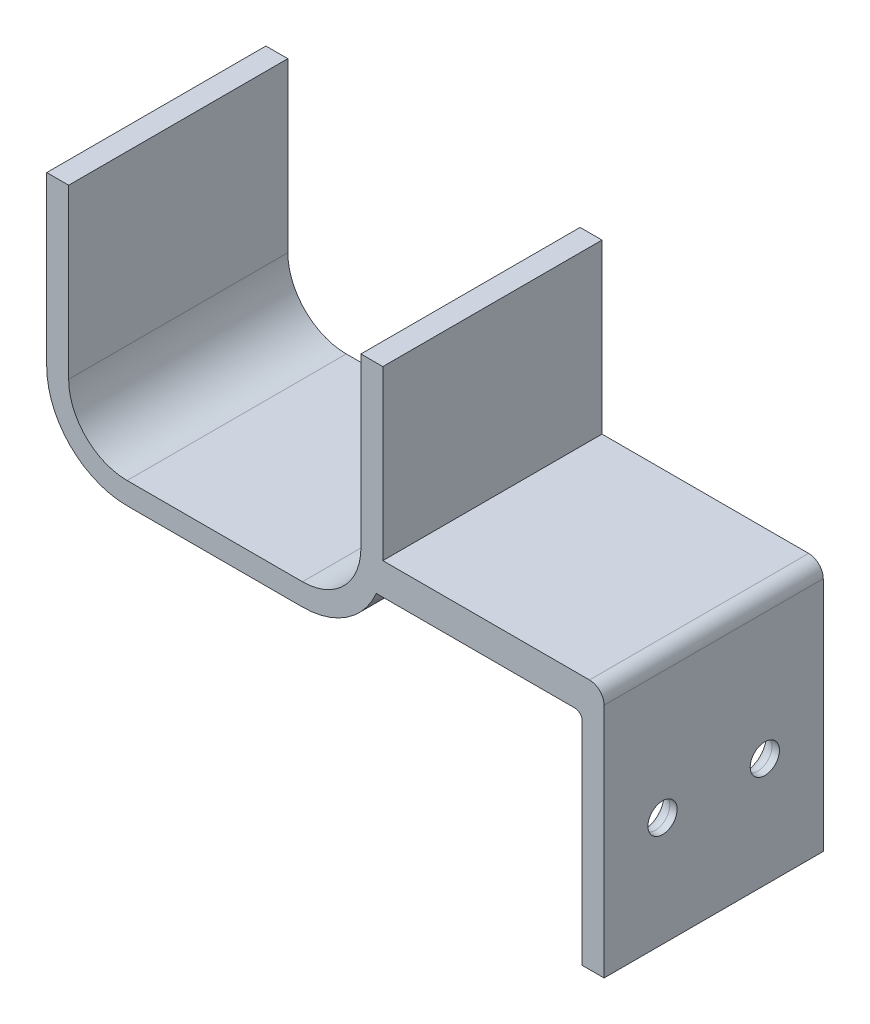
ISO-10303-21;
HEADER;
FILE_DESCRIPTION(('STEP AP214'),'2;1');
FILE_NAME('part.step','',(''),(''),'','','');
FILE_SCHEMA(('AUTOMOTIVE_DESIGN { 1 0 10303 214 1 1 1 1 }'));
ENDSEC;
DATA;
#1=APPLICATION_CONTEXT('core data for automotive mechanical design processes');
#2=APPLICATION_PROTOCOL_DEFINITION('international standard','automotive_design',2000,#1);
#3=PRODUCT_CONTEXT('',#1,'mechanical');
#4=PRODUCT('Part','Part','',(#3));
#5=PRODUCT_RELATED_PRODUCT_CATEGORY('part','',(#4));
#6=PRODUCT_DEFINITION_FORMATION('','',#4);
#7=PRODUCT_DEFINITION_CONTEXT('part definition',#1,'design');
#8=PRODUCT_DEFINITION('design','',#6,#7);
#9=PRODUCT_DEFINITION_SHAPE('','',#8);
#10=(LENGTH_UNIT() NAMED_UNIT(*) SI_UNIT(.MILLI.,.METRE.));
#11=(NAMED_UNIT(*) PLANE_ANGLE_UNIT() SI_UNIT($,.RADIAN.));
#12=(NAMED_UNIT(*) SI_UNIT($,.STERADIAN.) SOLID_ANGLE_UNIT());
#13=UNCERTAINTY_MEASURE_WITH_UNIT(LENGTH_MEASURE(1.E-05),#10,'distance_accuracy_value','');
#14=(GEOMETRIC_REPRESENTATION_CONTEXT(3) GLOBAL_UNCERTAINTY_ASSIGNED_CONTEXT((#13)) GLOBAL_UNIT_ASSIGNED_CONTEXT((#10,
#11,#12)) REPRESENTATION_CONTEXT('',''));
#15=CARTESIAN_POINT('',(0.,0.,0.));
#16=DIRECTION('',(0.,0.,1.));
#17=DIRECTION('',(1.,0.,0.));
#18=AXIS2_PLACEMENT_3D('',#15,#16,#17);
#19=CARTESIAN_POINT('',(53.282521300699,-27.3295887421391,30.));
#20=DIRECTION('',(0.,1.,0.));
#21=DIRECTION('',(-1.,0.,0.));
#22=AXIS2_PLACEMENT_3D('',#19,#20,#21);
#23=PLANE('',#22);
#24=DIRECTION('',(1.,0.,0.));
#25=VECTOR('',#24,1.);
#26=CARTESIAN_POINT('',(53.282521300699,-27.3295887421391,0.));
#27=LINE('',#26,#25);
#28=CARTESIAN_POINT('',(22.1121046930865,-27.3295887421391,0.));
#29=VERTEX_POINT('',#28);
#30=CARTESIAN_POINT('',(49.282521300699,-27.3295887421391,0.));
#31=VERTEX_POINT('',#30);
#32=EDGE_CURVE('E337',#29,#31,#27,.T.);
#33=ORIENTED_EDGE('',*,*,#32,.T.);
#34=DIRECTION('',(0.,0.,-1.));
#35=VECTOR('',#34,1.);
#36=CARTESIAN_POINT('',(49.282521300699,-27.3295887421391,30.));
#37=LINE('',#36,#35);
#38=CARTESIAN_POINT('',(49.282521300699,-27.3295887421391,30.));
#39=VERTEX_POINT('',#38);
#40=EDGE_CURVE('E211',#31,#39,#37,.F.);
#41=ORIENTED_EDGE('',*,*,#40,.T.);
#42=DIRECTION('',(1.,0.,0.));
#43=VECTOR('',#42,1.);
#44=CARTESIAN_POINT('',(53.282521300699,-27.3295887421391,30.));
#45=LINE('',#44,#43);
#46=CARTESIAN_POINT('',(22.1121046930865,-27.3295887421391,30.));
#47=VERTEX_POINT('',#46);
#48=EDGE_CURVE('E333',#47,#39,#45,.T.);
#49=ORIENTED_EDGE('',*,*,#48,.F.);
#50=DIRECTION('',(0.,0.,-1.));
#51=VECTOR('',#50,1.);
#52=CARTESIAN_POINT('',(22.1121046930865,-27.3295887421391,30.));
#53=LINE('',#52,#51);
#54=EDGE_CURVE('E328',#47,#29,#53,.T.);
#55=ORIENTED_EDGE('',*,*,#54,.T.);
#56=EDGE_LOOP('',(#33,#41,#49,#55));
#57=FACE_BOUND('',#56,.T.);
#58=ADVANCED_FACE('F32',(#57),#23,.F.);
#59=CARTESIAN_POINT('',(12.,-23.,30.));
#60=DIRECTION('',(0.,0.,-1.));
#61=DIRECTION('',(-1.,0.,0.));
#62=AXIS2_PLACEMENT_3D('',#59,#60,#61);
#63=CYLINDRICAL_SURFACE('',#62,11.);
#64=ORIENTED_EDGE('',*,*,#54,.F.);
#65=CARTESIAN_POINT('',(12.,-23.,30.));
#66=DIRECTION('',(0.,0.,1.));
#67=DIRECTION('',(1.,0.,0.));
#68=AXIS2_PLACEMENT_3D('',#65,#66,#67);
#69=CIRCLE('',#68,11.);
#70=CARTESIAN_POINT('',(11.9999999999999,-34.,30.));
#71=VERTEX_POINT('',#70);
#72=EDGE_CURVE('E379',#71,#47,#69,.T.);
#73=ORIENTED_EDGE('',*,*,#72,.F.);
#74=DIRECTION('',(0.,0.,-1.));
#75=VECTOR('',#74,1.);
#76=CARTESIAN_POINT('',(11.9999999999999,-34.,30.));
#77=LINE('',#76,#75);
#78=CARTESIAN_POINT('',(11.9999999999999,-34.,0.));
#79=VERTEX_POINT('',#78);
#80=EDGE_CURVE('E198',#71,#79,#77,.T.);
#81=ORIENTED_EDGE('',*,*,#80,.T.);
#82=CARTESIAN_POINT('',(12.,-23.,0.));
#83=DIRECTION('',(0.,0.,1.));
#84=DIRECTION('',(1.,0.,0.));
#85=AXIS2_PLACEMENT_3D('',#82,#83,#84);
#86=CIRCLE('',#85,11.);
#87=EDGE_CURVE('E188',#79,#29,#86,.T.);
#88=ORIENTED_EDGE('',*,*,#87,.T.);
#89=EDGE_LOOP('',(#64,#73,#81,#88));
#90=FACE_BOUND('',#89,.T.);
#91=ADVANCED_FACE('F253',(#90),#63,.T.);
#92=CARTESIAN_POINT('',(-12.,23.,30.));
#93=DIRECTION('',(0.,0.,1.));
#94=DIRECTION('',(1.,0.,0.));
#95=AXIS2_PLACEMENT_3D('',#92,#93,#94);
#96=PLANE('',#95);
#97=DIRECTION('',(-1.,0.,0.));
#98=VECTOR('',#97,1.);
#99=CARTESIAN_POINT('',(36.6151559084504,0.,30.));
#100=LINE('',#99,#98);
#101=CARTESIAN_POINT('',(-20.,0.,30.));
#102=VERTEX_POINT('',#101);
#103=CARTESIAN_POINT('',(-23.,0.,30.));
#104=VERTEX_POINT('',#103);
#105=EDGE_CURVE('E47',#102,#104,#100,.T.);
#106=ORIENTED_EDGE('',*,*,#105,.T.);
#107=DIRECTION('',(0.,-1.,0.));
#108=VECTOR('',#107,1.);
#109=CARTESIAN_POINT('',(-23.,23.,30.));
#110=LINE('',#109,#108);
#111=CARTESIAN_POINT('',(-23.,-22.9999999999999,30.));
#112=VERTEX_POINT('',#111);
#113=EDGE_CURVE('E187',#104,#112,#110,.T.);
#114=ORIENTED_EDGE('',*,*,#113,.T.);
#115=CARTESIAN_POINT('',(-12.,-23.,30.));
#116=DIRECTION('',(0.,0.,1.));
#117=DIRECTION('',(1.,0.,0.));
#118=AXIS2_PLACEMENT_3D('',#115,#116,#117);
#119=CIRCLE('',#118,11.);
#120=CARTESIAN_POINT('',(-11.9999999999999,-34.,30.));
#121=VERTEX_POINT('',#120);
#122=EDGE_CURVE('E190',#112,#121,#119,.T.);
#123=ORIENTED_EDGE('',*,*,#122,.T.);
#124=DIRECTION('',(1.,0.,0.));
#125=VECTOR('',#124,1.);
#126=CARTESIAN_POINT('',(-11.9999999999999,-34.,30.));
#127=LINE('',#126,#125);
#128=EDGE_CURVE('E377',#121,#71,#127,.T.);
#129=ORIENTED_EDGE('',*,*,#128,.T.);
#130=ORIENTED_EDGE('',*,*,#72,.T.);
#131=ORIENTED_EDGE('',*,*,#48,.T.);
#132=CARTESIAN_POINT('',(49.282521300699,-28.3295887421391,30.));
#133=DIRECTION('',(0.,0.,1.));
#134=DIRECTION('',(1.,0.,0.));
#135=AXIS2_PLACEMENT_3D('',#132,#133,#134);
#136=CIRCLE('',#135,1.);
#137=CARTESIAN_POINT('',(50.282521300699,-28.3295887421391,30.));
#138=VERTEX_POINT('',#137);
#139=EDGE_CURVE('E215',#39,#138,#136,.F.);
#140=ORIENTED_EDGE('',*,*,#139,.T.);
#141=DIRECTION('',(0.,1.,0.));
#142=VECTOR('',#141,1.);
#143=CARTESIAN_POINT('',(50.282521300699,-57.3295887421391,30.));
#144=LINE('',#143,#142);
#145=CARTESIAN_POINT('',(50.282521300699,-57.3295887421391,30.));
#146=VERTEX_POINT('',#145);
#147=EDGE_CURVE('E340',#146,#138,#144,.T.);
#148=ORIENTED_EDGE('',*,*,#147,.F.);
#149=DIRECTION('',(-1.,0.,0.));
#150=VECTOR('',#149,1.);
#151=CARTESIAN_POINT('',(53.282521300699,-57.3295887421391,30.));
#152=LINE('',#151,#150);
#153=CARTESIAN_POINT('',(53.282521300699,-57.3295887421391,30.));
#154=VERTEX_POINT('',#153);
#155=EDGE_CURVE('E415',#154,#146,#152,.T.);
#156=ORIENTED_EDGE('',*,*,#155,.F.);
#157=DIRECTION('',(0.,1.,0.));
#158=VECTOR('',#157,1.);
#159=CARTESIAN_POINT('',(53.282521300699,-23.,30.));
#160=LINE('',#159,#158);
#161=CARTESIAN_POINT('',(53.282521300699,-25.,30.));
#162=VERTEX_POINT('',#161);
#163=EDGE_CURVE('E325',#154,#162,#160,.T.);
#164=ORIENTED_EDGE('',*,*,#163,.T.);
#165=CARTESIAN_POINT('',(51.282521300699,-25.,30.));
#166=DIRECTION('',(0.,0.,1.));
#167=DIRECTION('',(1.,0.,0.));
#168=AXIS2_PLACEMENT_3D('',#165,#166,#167);
#169=CIRCLE('',#168,2.);
#170=CARTESIAN_POINT('',(51.282521300699,-23.,30.));
#171=VERTEX_POINT('',#170);
#172=EDGE_CURVE('E224',#162,#171,#169,.T.);
#173=ORIENTED_EDGE('',*,*,#172,.T.);
#174=DIRECTION('',(-1.,0.,0.));
#175=VECTOR('',#174,1.);
#176=CARTESIAN_POINT('',(23.,-22.9999999999999,30.));
#177=LINE('',#176,#175);
#178=CARTESIAN_POINT('',(23.,-22.9999999999999,30.));
#179=VERTEX_POINT('',#178);
#180=EDGE_CURVE('E323',#171,#179,#177,.T.);
#181=ORIENTED_EDGE('',*,*,#180,.T.);
#182=DIRECTION('',(0.,1.,0.));
#183=VECTOR('',#182,1.);
#184=CARTESIAN_POINT('',(23.,22.9999999999999,30.));
#185=LINE('',#184,#183);
#186=CARTESIAN_POINT('',(23.,0.,30.));
#187=VERTEX_POINT('',#186);
#188=EDGE_CURVE('E199',#179,#187,#185,.T.);
#189=ORIENTED_EDGE('',*,*,#188,.T.);
#190=CARTESIAN_POINT('',(20.,0.,30.));
#191=VERTEX_POINT('',#190);
#192=EDGE_CURVE('E163',#187,#191,#100,.T.);
#193=ORIENTED_EDGE('',*,*,#192,.T.);
#194=DIRECTION('',(0.,1.,0.));
#195=VECTOR('',#194,1.);
#196=CARTESIAN_POINT('',(20.,22.9999999999999,30.));
#197=LINE('',#196,#195);
#198=CARTESIAN_POINT('',(20.,-22.9999999999999,30.));
#199=VERTEX_POINT('',#198);
#200=EDGE_CURVE('E353',#199,#191,#197,.T.);
#201=ORIENTED_EDGE('',*,*,#200,.F.);
#202=CARTESIAN_POINT('',(12.,-23.,30.));
#203=DIRECTION('',(0.,0.,1.));
#204=DIRECTION('',(1.,0.,0.));
#205=AXIS2_PLACEMENT_3D('',#202,#203,#204);
#206=CIRCLE('',#205,8.);
#207=CARTESIAN_POINT('',(11.9999999999999,-31.,30.));
#208=VERTEX_POINT('',#207);
#209=EDGE_CURVE('E351',#208,#199,#206,.T.);
#210=ORIENTED_EDGE('',*,*,#209,.F.);
#211=DIRECTION('',(1.,0.,0.));
#212=VECTOR('',#211,1.);
#213=CARTESIAN_POINT('',(-11.9999999999999,-31.,30.));
#214=LINE('',#213,#212);
#215=CARTESIAN_POINT('',(-11.9999999999999,-31.,30.));
#216=VERTEX_POINT('',#215);
#217=EDGE_CURVE('E349',#216,#208,#214,.T.);
#218=ORIENTED_EDGE('',*,*,#217,.F.);
#219=CARTESIAN_POINT('',(-12.,-23.,30.));
#220=DIRECTION('',(0.,0.,1.));
#221=DIRECTION('',(1.,0.,0.));
#222=AXIS2_PLACEMENT_3D('',#219,#220,#221);
#223=CIRCLE('',#222,8.);
#224=CARTESIAN_POINT('',(-20.,-22.9999999999999,30.));
#225=VERTEX_POINT('',#224);
#226=EDGE_CURVE('E347',#225,#216,#223,.T.);
#227=ORIENTED_EDGE('',*,*,#226,.F.);
#228=DIRECTION('',(0.,-1.,0.));
#229=VECTOR('',#228,1.);
#230=CARTESIAN_POINT('',(-20.,23.,30.));
#231=LINE('',#230,#229);
#232=EDGE_CURVE('E345',#102,#225,#231,.T.);
#233=ORIENTED_EDGE('',*,*,#232,.F.);
#234=EDGE_LOOP('',(#106,#114,#123,#129,#130,#131,#140,#148,#156,#164,#173,#181,#189,#193,#201,
#210,#218,#227,#233));
#235=FACE_BOUND('',#234,.T.);
#236=ADVANCED_FACE('F259',(#235),#96,.T.);
#237=CARTESIAN_POINT('',(-12.,23.,0.));
#238=DIRECTION('',(0.,0.,1.));
#239=DIRECTION('',(1.,0.,0.));
#240=AXIS2_PLACEMENT_3D('',#237,#238,#239);
#241=PLANE('',#240);
#242=DIRECTION('',(0.,-1.,0.));
#243=VECTOR('',#242,1.);
#244=CARTESIAN_POINT('',(-23.,23.,0.));
#245=LINE('',#244,#243);
#246=CARTESIAN_POINT('',(-23.,0.,0.));
#247=VERTEX_POINT('',#246);
#248=CARTESIAN_POINT('',(-23.,-22.9999999999999,0.));
#249=VERTEX_POINT('',#248);
#250=EDGE_CURVE('E374',#247,#249,#245,.T.);
#251=ORIENTED_EDGE('',*,*,#250,.F.);
#252=DIRECTION('',(-1.,0.,0.));
#253=VECTOR('',#252,1.);
#254=CARTESIAN_POINT('',(36.6151559084504,0.,0.));
#255=LINE('',#254,#253);
#256=CARTESIAN_POINT('',(-20.,0.,0.));
#257=VERTEX_POINT('',#256);
#258=EDGE_CURVE('E181',#257,#247,#255,.T.);
#259=ORIENTED_EDGE('',*,*,#258,.F.);
#260=DIRECTION('',(0.,-1.,0.));
#261=VECTOR('',#260,1.);
#262=CARTESIAN_POINT('',(-20.,23.,0.));
#263=LINE('',#262,#261);
#264=CARTESIAN_POINT('',(-20.,-22.9999999999999,0.));
#265=VERTEX_POINT('',#264);
#266=EDGE_CURVE('E331',#257,#265,#263,.T.);
#267=ORIENTED_EDGE('',*,*,#266,.T.);
#268=CARTESIAN_POINT('',(-12.,-23.,0.));
#269=DIRECTION('',(0.,0.,1.));
#270=DIRECTION('',(1.,0.,0.));
#271=AXIS2_PLACEMENT_3D('',#268,#269,#270);
#272=CIRCLE('',#271,8.);
#273=CARTESIAN_POINT('',(-11.9999999999999,-31.,0.));
#274=VERTEX_POINT('',#273);
#275=EDGE_CURVE('E358',#265,#274,#272,.T.);
#276=ORIENTED_EDGE('',*,*,#275,.T.);
#277=DIRECTION('',(1.,0.,0.));
#278=VECTOR('',#277,1.);
#279=CARTESIAN_POINT('',(-11.9999999999999,-31.,0.));
#280=LINE('',#279,#278);
#281=CARTESIAN_POINT('',(11.9999999999999,-31.,0.));
#282=VERTEX_POINT('',#281);
#283=EDGE_CURVE('E361',#274,#282,#280,.T.);
#284=ORIENTED_EDGE('',*,*,#283,.T.);
#285=CARTESIAN_POINT('',(12.,-23.,0.));
#286=DIRECTION('',(0.,0.,1.));
#287=DIRECTION('',(1.,0.,0.));
#288=AXIS2_PLACEMENT_3D('',#285,#286,#287);
#289=CIRCLE('',#288,8.);
#290=CARTESIAN_POINT('',(20.,-22.9999999999999,0.));
#291=VERTEX_POINT('',#290);
#292=EDGE_CURVE('E364',#282,#291,#289,.T.);
#293=ORIENTED_EDGE('',*,*,#292,.T.);
#294=DIRECTION('',(0.,1.,0.));
#295=VECTOR('',#294,1.);
#296=CARTESIAN_POINT('',(20.,22.9999999999999,0.));
#297=LINE('',#296,#295);
#298=CARTESIAN_POINT('',(20.,0.,0.));
#299=VERTEX_POINT('',#298);
#300=EDGE_CURVE('E180',#291,#299,#297,.T.);
#301=ORIENTED_EDGE('',*,*,#300,.T.);
#302=CARTESIAN_POINT('',(23.,0.,0.));
#303=VERTEX_POINT('',#302);
#304=EDGE_CURVE('E54',#303,#299,#255,.T.);
#305=ORIENTED_EDGE('',*,*,#304,.F.);
#306=DIRECTION('',(0.,1.,0.));
#307=VECTOR('',#306,1.);
#308=CARTESIAN_POINT('',(23.,22.9999999999999,0.));
#309=LINE('',#308,#307);
#310=CARTESIAN_POINT('',(23.,-22.9999999999999,0.));
#311=VERTEX_POINT('',#310);
#312=EDGE_CURVE('E177',#311,#303,#309,.T.);
#313=ORIENTED_EDGE('',*,*,#312,.F.);
#314=DIRECTION('',(-1.,0.,0.));
#315=VECTOR('',#314,1.);
#316=CARTESIAN_POINT('',(23.,-22.9999999999999,0.));
#317=LINE('',#316,#315);
#318=CARTESIAN_POINT('',(51.282521300699,-23.,0.));
#319=VERTEX_POINT('',#318);
#320=EDGE_CURVE('E343',#319,#311,#317,.T.);
#321=ORIENTED_EDGE('',*,*,#320,.F.);
#322=CARTESIAN_POINT('',(51.282521300699,-25.,0.));
#323=DIRECTION('',(0.,0.,1.));
#324=DIRECTION('',(1.,0.,0.));
#325=AXIS2_PLACEMENT_3D('',#322,#323,#324);
#326=CIRCLE('',#325,2.);
#327=CARTESIAN_POINT('',(53.282521300699,-25.,0.));
#328=VERTEX_POINT('',#327);
#329=EDGE_CURVE('E220',#319,#328,#326,.F.);
#330=ORIENTED_EDGE('',*,*,#329,.T.);
#331=DIRECTION('',(0.,1.,0.));
#332=VECTOR('',#331,1.);
#333=CARTESIAN_POINT('',(53.282521300699,-23.,0.));
#334=LINE('',#333,#332);
#335=CARTESIAN_POINT('',(53.282521300699,-57.3295887421391,0.));
#336=VERTEX_POINT('',#335);
#337=EDGE_CURVE('E339',#336,#328,#334,.T.);
#338=ORIENTED_EDGE('',*,*,#337,.F.);
#339=DIRECTION('',(1.,0.,0.));
#340=VECTOR('',#339,1.);
#341=CARTESIAN_POINT('',(53.282521300699,-57.3295887421391,0.));
#342=LINE('',#341,#340);
#343=CARTESIAN_POINT('',(50.282521300699,-57.3295887421391,0.));
#344=VERTEX_POINT('',#343);
#345=EDGE_CURVE('E419',#344,#336,#342,.T.);
#346=ORIENTED_EDGE('',*,*,#345,.F.);
#347=DIRECTION('',(0.,1.,0.));
#348=VECTOR('',#347,1.);
#349=CARTESIAN_POINT('',(50.282521300699,-57.3295887421391,0.));
#350=LINE('',#349,#348);
#351=CARTESIAN_POINT('',(50.282521300699,-28.3295887421391,0.));
#352=VERTEX_POINT('',#351);
#353=EDGE_CURVE('E422',#344,#352,#350,.T.);
#354=ORIENTED_EDGE('',*,*,#353,.T.);
#355=CARTESIAN_POINT('',(49.282521300699,-28.3295887421391,0.));
#356=DIRECTION('',(0.,0.,1.));
#357=DIRECTION('',(1.,0.,0.));
#358=AXIS2_PLACEMENT_3D('',#355,#356,#357);
#359=CIRCLE('',#358,1.);
#360=EDGE_CURVE('E213',#352,#31,#359,.T.);
#361=ORIENTED_EDGE('',*,*,#360,.T.);
#362=ORIENTED_EDGE('',*,*,#32,.F.);
#363=ORIENTED_EDGE('',*,*,#87,.F.);
#364=DIRECTION('',(1.,0.,0.));
#365=VECTOR('',#364,1.);
#366=CARTESIAN_POINT('',(-11.9999999999999,-34.,0.));
#367=LINE('',#366,#365);
#368=CARTESIAN_POINT('',(-11.9999999999999,-34.,0.));
#369=VERTEX_POINT('',#368);
#370=EDGE_CURVE('E193',#369,#79,#367,.T.);
#371=ORIENTED_EDGE('',*,*,#370,.F.);
#372=CARTESIAN_POINT('',(-12.,-23.,0.));
#373=DIRECTION('',(0.,0.,1.));
#374=DIRECTION('',(1.,0.,0.));
#375=AXIS2_PLACEMENT_3D('',#372,#373,#374);
#376=CIRCLE('',#375,11.);
#377=EDGE_CURVE('E384',#249,#369,#376,.T.);
#378=ORIENTED_EDGE('',*,*,#377,.F.);
#379=EDGE_LOOP('',(#251,#259,#267,#276,#284,#293,#301,#305,#313,#321,#330,#338,#346,#354,#361,
#362,#363,#371,#378));
#380=FACE_BOUND('',#379,.T.);
#381=ADVANCED_FACE('F175',(#380),#241,.F.);
#382=CARTESIAN_POINT('',(-23.,23.,30.));
#383=DIRECTION('',(1.,0.,0.));
#384=DIRECTION('',(0.,1.,0.));
#385=AXIS2_PLACEMENT_3D('',#382,#383,#384);
#386=PLANE('',#385);
#387=ORIENTED_EDGE('',*,*,#113,.F.);
#388=DIRECTION('',(0.,0.,-1.));
#389=VECTOR('',#388,1.);
#390=CARTESIAN_POINT('',(-23.,0.,30.));
#391=LINE('',#390,#389);
#392=EDGE_CURVE('E168',#104,#247,#391,.T.);
#393=ORIENTED_EDGE('',*,*,#392,.T.);
#394=ORIENTED_EDGE('',*,*,#250,.T.);
#395=DIRECTION('',(0.,0.,-1.));
#396=VECTOR('',#395,1.);
#397=CARTESIAN_POINT('',(-23.,-22.9999999999999,30.));
#398=LINE('',#397,#396);
#399=EDGE_CURVE('E205',#112,#249,#398,.T.);
#400=ORIENTED_EDGE('',*,*,#399,.F.);
#401=EDGE_LOOP('',(#387,#393,#394,#400));
#402=FACE_BOUND('',#401,.T.);
#403=ADVANCED_FACE('F292',(#402),#386,.F.);
#404=CARTESIAN_POINT('',(-12.,-23.,30.));
#405=DIRECTION('',(0.,0.,-1.));
#406=DIRECTION('',(-1.,0.,0.));
#407=AXIS2_PLACEMENT_3D('',#404,#405,#406);
#408=CYLINDRICAL_SURFACE('',#407,11.);
#409=ORIENTED_EDGE('',*,*,#377,.T.);
#410=DIRECTION('',(0.,0.,-1.));
#411=VECTOR('',#410,1.);
#412=CARTESIAN_POINT('',(-11.9999999999999,-34.,30.));
#413=LINE('',#412,#411);
#414=EDGE_CURVE('E202',#121,#369,#413,.T.);
#415=ORIENTED_EDGE('',*,*,#414,.F.);
#416=ORIENTED_EDGE('',*,*,#122,.F.);
#417=ORIENTED_EDGE('',*,*,#399,.T.);
#418=EDGE_LOOP('',(#409,#415,#416,#417));
#419=FACE_BOUND('',#418,.T.);
#420=ADVANCED_FACE('F298',(#419),#408,.T.);
#421=CARTESIAN_POINT('',(-11.9999999999999,-34.,30.));
#422=DIRECTION('',(0.,1.,0.));
#423=DIRECTION('',(0.,0.,1.));
#424=AXIS2_PLACEMENT_3D('',#421,#422,#423);
#425=PLANE('',#424);
#426=ORIENTED_EDGE('',*,*,#370,.T.);
#427=ORIENTED_EDGE('',*,*,#80,.F.);
#428=ORIENTED_EDGE('',*,*,#128,.F.);
#429=ORIENTED_EDGE('',*,*,#414,.T.);
#430=EDGE_LOOP('',(#426,#427,#428,#429));
#431=FACE_BOUND('',#430,.T.);
#432=ADVANCED_FACE('F294',(#431),#425,.F.);
#433=CARTESIAN_POINT('',(23.,22.9999999999999,30.));
#434=DIRECTION('',(-1.,0.,0.));
#435=DIRECTION('',(0.,-1.,0.));
#436=AXIS2_PLACEMENT_3D('',#433,#434,#435);
#437=PLANE('',#436);
#438=ORIENTED_EDGE('',*,*,#312,.T.);
#439=DIRECTION('',(0.,0.,1.));
#440=VECTOR('',#439,1.);
#441=CARTESIAN_POINT('',(23.,0.,30.));
#442=LINE('',#441,#440);
#443=EDGE_CURVE('E160',#303,#187,#442,.T.);
#444=ORIENTED_EDGE('',*,*,#443,.T.);
#445=ORIENTED_EDGE('',*,*,#188,.F.);
#446=DIRECTION('',(0.,0.,-1.));
#447=VECTOR('',#446,1.);
#448=CARTESIAN_POINT('',(23.,-22.9999999999999,30.));
#449=LINE('',#448,#447);
#450=EDGE_CURVE('E186',#179,#311,#449,.T.);
#451=ORIENTED_EDGE('',*,*,#450,.T.);
#452=EDGE_LOOP('',(#438,#444,#445,#451));
#453=FACE_BOUND('',#452,.T.);
#454=ADVANCED_FACE('F184',(#453),#437,.F.);
#455=CARTESIAN_POINT('',(-20.,23.,30.));
#456=DIRECTION('',(1.,0.,0.));
#457=DIRECTION('',(0.,1.,0.));
#458=AXIS2_PLACEMENT_3D('',#455,#456,#457);
#459=PLANE('',#458);
#460=DIRECTION('',(0.,0.,-1.));
#461=VECTOR('',#460,1.);
#462=CARTESIAN_POINT('',(-20.,0.,30.));
#463=LINE('',#462,#461);
#464=EDGE_CURVE('E169',#102,#257,#463,.T.);
#465=ORIENTED_EDGE('',*,*,#464,.F.);
#466=ORIENTED_EDGE('',*,*,#232,.T.);
#467=DIRECTION('',(0.,0.,-1.));
#468=VECTOR('',#467,1.);
#469=CARTESIAN_POINT('',(-20.,-22.9999999999999,30.));
#470=LINE('',#469,#468);
#471=EDGE_CURVE('E372',#225,#265,#470,.T.);
#472=ORIENTED_EDGE('',*,*,#471,.T.);
#473=ORIENTED_EDGE('',*,*,#266,.F.);
#474=EDGE_LOOP('',(#465,#466,#472,#473));
#475=FACE_BOUND('',#474,.T.);
#476=ADVANCED_FACE('F282',(#475),#459,.T.);
#477=CARTESIAN_POINT('',(-12.,-23.,30.));
#478=DIRECTION('',(0.,0.,-1.));
#479=DIRECTION('',(-1.,0.,0.));
#480=AXIS2_PLACEMENT_3D('',#477,#478,#479);
#481=CYLINDRICAL_SURFACE('',#480,8.);
#482=ORIENTED_EDGE('',*,*,#275,.F.);
#483=ORIENTED_EDGE('',*,*,#471,.F.);
#484=ORIENTED_EDGE('',*,*,#226,.T.);
#485=DIRECTION('',(0.,0.,-1.));
#486=VECTOR('',#485,1.);
#487=CARTESIAN_POINT('',(-11.9999999999999,-31.,30.));
#488=LINE('',#487,#486);
#489=EDGE_CURVE('E370',#216,#274,#488,.T.);
#490=ORIENTED_EDGE('',*,*,#489,.T.);
#491=EDGE_LOOP('',(#482,#483,#484,#490));
#492=FACE_BOUND('',#491,.T.);
#493=ADVANCED_FACE('F278',(#492),#481,.F.);
#494=CARTESIAN_POINT('',(-11.9999999999999,-31.,30.));
#495=DIRECTION('',(0.,1.,0.));
#496=DIRECTION('',(0.,0.,1.));
#497=AXIS2_PLACEMENT_3D('',#494,#495,#496);
#498=PLANE('',#497);
#499=ORIENTED_EDGE('',*,*,#283,.F.);
#500=ORIENTED_EDGE('',*,*,#489,.F.);
#501=ORIENTED_EDGE('',*,*,#217,.T.);
#502=DIRECTION('',(0.,0.,-1.));
#503=VECTOR('',#502,1.);
#504=CARTESIAN_POINT('',(11.9999999999999,-31.,30.));
#505=LINE('',#504,#503);
#506=EDGE_CURVE('E368',#208,#282,#505,.T.);
#507=ORIENTED_EDGE('',*,*,#506,.T.);
#508=EDGE_LOOP('',(#499,#500,#501,#507));
#509=FACE_BOUND('',#508,.T.);
#510=ADVANCED_FACE('F274',(#509),#498,.T.);
#511=CARTESIAN_POINT('',(12.,-23.,30.));
#512=DIRECTION('',(0.,0.,-1.));
#513=DIRECTION('',(-1.,0.,0.));
#514=AXIS2_PLACEMENT_3D('',#511,#512,#513);
#515=CYLINDRICAL_SURFACE('',#514,8.);
#516=ORIENTED_EDGE('',*,*,#292,.F.);
#517=ORIENTED_EDGE('',*,*,#506,.F.);
#518=ORIENTED_EDGE('',*,*,#209,.T.);
#519=DIRECTION('',(0.,0.,-1.));
#520=VECTOR('',#519,1.);
#521=CARTESIAN_POINT('',(20.,-22.9999999999999,30.));
#522=LINE('',#521,#520);
#523=EDGE_CURVE('E356',#199,#291,#522,.T.);
#524=ORIENTED_EDGE('',*,*,#523,.T.);
#525=EDGE_LOOP('',(#516,#517,#518,#524));
#526=FACE_BOUND('',#525,.T.);
#527=ADVANCED_FACE('F270',(#526),#515,.F.);
#528=CARTESIAN_POINT('',(20.,22.9999999999999,30.));
#529=DIRECTION('',(-1.,0.,0.));
#530=DIRECTION('',(0.,-1.,0.));
#531=AXIS2_PLACEMENT_3D('',#528,#529,#530);
#532=PLANE('',#531);
#533=DIRECTION('',(0.,0.,1.));
#534=VECTOR('',#533,1.);
#535=CARTESIAN_POINT('',(20.,0.,30.));
#536=LINE('',#535,#534);
#537=EDGE_CURVE('E11',#299,#191,#536,.T.);
#538=ORIENTED_EDGE('',*,*,#537,.F.);
#539=ORIENTED_EDGE('',*,*,#300,.F.);
#540=ORIENTED_EDGE('',*,*,#523,.F.);
#541=ORIENTED_EDGE('',*,*,#200,.T.);
#542=EDGE_LOOP('',(#538,#539,#540,#541));
#543=FACE_BOUND('',#542,.T.);
#544=ADVANCED_FACE('F267',(#543),#532,.T.);
#545=CARTESIAN_POINT('',(53.282521300699,-23.,30.));
#546=DIRECTION('',(-1.,0.,0.));
#547=DIRECTION('',(0.,0.,1.));
#548=AXIS2_PLACEMENT_3D('',#545,#546,#547);
#549=PLANE('',#548);
#550=CARTESIAN_POINT('',(53.282521300699,-42.3295887421391,22.));
#551=DIRECTION('',(-1.,0.,0.));
#552=DIRECTION('',(0.,0.,1.));
#553=AXIS2_PLACEMENT_3D('',#550,#551,#552);
#554=CIRCLE('',#553,2.);
#555=CARTESIAN_POINT('',(53.282521300699,-42.3295887421391,24.));
#556=VERTEX_POINT('',#555);
#557=EDGE_CURVE('E406',#556,#556,#554,.T.);
#558=ORIENTED_EDGE('',*,*,#557,.T.);
#559=EDGE_LOOP('',(#558));
#560=FACE_BOUND('',#559,.T.);
#561=CARTESIAN_POINT('',(53.282521300699,-42.3295887421391,8.));
#562=DIRECTION('',(-1.,0.,0.));
#563=DIRECTION('',(0.,0.,1.));
#564=AXIS2_PLACEMENT_3D('',#561,#562,#563);
#565=CIRCLE('',#564,2.);
#566=CARTESIAN_POINT('',(53.282521300699,-42.3295887421391,10.));
#567=VERTEX_POINT('',#566);
#568=EDGE_CURVE('E403',#567,#567,#565,.T.);
#569=ORIENTED_EDGE('',*,*,#568,.T.);
#570=EDGE_LOOP('',(#569));
#571=FACE_BOUND('',#570,.T.);
#572=ORIENTED_EDGE('',*,*,#337,.T.);
#573=DIRECTION('',(0.,0.,-1.));
#574=VECTOR('',#573,1.);
#575=CARTESIAN_POINT('',(53.282521300699,-25.,30.));
#576=LINE('',#575,#574);
#577=EDGE_CURVE('E222',#328,#162,#576,.F.);
#578=ORIENTED_EDGE('',*,*,#577,.T.);
#579=ORIENTED_EDGE('',*,*,#163,.F.);
#580=DIRECTION('',(0.,0.,1.));
#581=VECTOR('',#580,1.);
#582=CARTESIAN_POINT('',(53.282521300699,-57.3295887421391,0.));
#583=LINE('',#582,#581);
#584=EDGE_CURVE('E412',#336,#154,#583,.T.);
#585=ORIENTED_EDGE('',*,*,#584,.F.);
#586=EDGE_LOOP('',(#572,#578,#579,#585));
#587=FACE_BOUND('',#586,.T.);
#588=ADVANCED_FACE('F265',(#560,#571,#587),#549,.F.);
#589=CARTESIAN_POINT('',(23.,-22.9999999999999,30.));
#590=DIRECTION('',(0.,-1.,0.));
#591=DIRECTION('',(1.,0.,0.));
#592=AXIS2_PLACEMENT_3D('',#589,#590,#591);
#593=PLANE('',#592);
#594=ORIENTED_EDGE('',*,*,#180,.F.);
#595=DIRECTION('',(0.,0.,-1.));
#596=VECTOR('',#595,1.);
#597=CARTESIAN_POINT('',(51.282521300699,-23.,30.));
#598=LINE('',#597,#596);
#599=EDGE_CURVE('E217',#171,#319,#598,.T.);
#600=ORIENTED_EDGE('',*,*,#599,.T.);
#601=ORIENTED_EDGE('',*,*,#320,.T.);
#602=ORIENTED_EDGE('',*,*,#450,.F.);
#603=EDGE_LOOP('',(#594,#600,#601,#602));
#604=FACE_BOUND('',#603,.T.);
#605=ADVANCED_FACE('F327',(#604),#593,.F.);
#606=CARTESIAN_POINT('',(50.282521300699,-57.3295887421391,0.));
#607=DIRECTION('',(1.,0.,0.));
#608=DIRECTION('',(0.,1.,0.));
#609=AXIS2_PLACEMENT_3D('',#606,#607,#608);
#610=PLANE('',#609);
#611=CARTESIAN_POINT('',(50.282521300699,-42.3295887421391,22.));
#612=DIRECTION('',(1.,0.,0.));
#613=DIRECTION('',(0.,1.,0.));
#614=AXIS2_PLACEMENT_3D('',#611,#612,#613);
#615=CIRCLE('',#614,4.);
#616=CARTESIAN_POINT('',(50.282521300699,-38.3295887421391,22.));
#617=VERTEX_POINT('',#616);
#618=EDGE_CURVE('E232',#617,#617,#615,.T.);
#619=ORIENTED_EDGE('',*,*,#618,.T.);
#620=EDGE_LOOP('',(#619));
#621=FACE_BOUND('',#620,.T.);
#622=CARTESIAN_POINT('',(50.282521300699,-42.3295887421391,8.));
#623=DIRECTION('',(1.,0.,0.));
#624=DIRECTION('',(0.,1.,0.));
#625=AXIS2_PLACEMENT_3D('',#622,#623,#624);
#626=CIRCLE('',#625,4.);
#627=CARTESIAN_POINT('',(50.282521300699,-38.3295887421391,8.));
#628=VERTEX_POINT('',#627);
#629=EDGE_CURVE('E229',#628,#628,#626,.T.);
#630=ORIENTED_EDGE('',*,*,#629,.T.);
#631=EDGE_LOOP('',(#630));
#632=FACE_BOUND('',#631,.T.);
#633=ORIENTED_EDGE('',*,*,#147,.T.);
#634=DIRECTION('',(0.,0.,-1.));
#635=VECTOR('',#634,1.);
#636=CARTESIAN_POINT('',(50.282521300699,-28.3295887421391,0.));
#637=LINE('',#636,#635);
#638=EDGE_CURVE('E208',#138,#352,#637,.T.);
#639=ORIENTED_EDGE('',*,*,#638,.T.);
#640=ORIENTED_EDGE('',*,*,#353,.F.);
#641=DIRECTION('',(0.,0.,-1.));
#642=VECTOR('',#641,1.);
#643=CARTESIAN_POINT('',(50.282521300699,-57.3295887421391,0.));
#644=LINE('',#643,#642);
#645=EDGE_CURVE('E417',#146,#344,#644,.T.);
#646=ORIENTED_EDGE('',*,*,#645,.F.);
#647=EDGE_LOOP('',(#633,#639,#640,#646));
#648=FACE_BOUND('',#647,.T.);
#649=ADVANCED_FACE('F429',(#621,#632,#648),#610,.F.);
#650=CARTESIAN_POINT('',(0.,-57.3295887421391,0.));
#651=DIRECTION('',(0.,-1.,0.));
#652=DIRECTION('',(0.,0.,-1.));
#653=AXIS2_PLACEMENT_3D('',#650,#651,#652);
#654=PLANE('',#653);
#655=ORIENTED_EDGE('',*,*,#584,.T.);
#656=ORIENTED_EDGE('',*,*,#155,.T.);
#657=ORIENTED_EDGE('',*,*,#645,.T.);
#658=ORIENTED_EDGE('',*,*,#345,.T.);
#659=EDGE_LOOP('',(#655,#656,#657,#658));
#660=FACE_BOUND('',#659,.T.);
#661=ADVANCED_FACE('F310',(#660),#654,.T.);
#662=CARTESIAN_POINT('',(49.282521300699,-28.3295887421391,0.));
#663=DIRECTION('',(0.,0.,1.));
#664=DIRECTION('',(1.,0.,0.));
#665=AXIS2_PLACEMENT_3D('',#662,#663,#664);
#666=CYLINDRICAL_SURFACE('',#665,1.);
#667=ORIENTED_EDGE('',*,*,#139,.F.);
#668=ORIENTED_EDGE('',*,*,#40,.F.);
#669=ORIENTED_EDGE('',*,*,#360,.F.);
#670=ORIENTED_EDGE('',*,*,#638,.F.);
#671=EDGE_LOOP('',(#667,#668,#669,#670));
#672=FACE_BOUND('',#671,.T.);
#673=ADVANCED_FACE('F306',(#672),#666,.F.);
#674=CARTESIAN_POINT('',(51.282521300699,-25.,30.));
#675=DIRECTION('',(0.,0.,-1.));
#676=DIRECTION('',(-1.,0.,0.));
#677=AXIS2_PLACEMENT_3D('',#674,#675,#676);
#678=CYLINDRICAL_SURFACE('',#677,2.);
#679=ORIENTED_EDGE('',*,*,#172,.F.);
#680=ORIENTED_EDGE('',*,*,#577,.F.);
#681=ORIENTED_EDGE('',*,*,#329,.F.);
#682=ORIENTED_EDGE('',*,*,#599,.F.);
#683=EDGE_LOOP('',(#679,#680,#681,#682));
#684=FACE_BOUND('',#683,.T.);
#685=ADVANCED_FACE('F309',(#684),#678,.T.);
#686=CARTESIAN_POINT('',(80.282521300699,-42.3295887421391,8.));
#687=DIRECTION('',(-1.,0.,0.));
#688=DIRECTION('',(0.,-1.,0.));
#689=AXIS2_PLACEMENT_3D('',#686,#687,#688);
#690=CYLINDRICAL_SURFACE('',#689,2.);
#691=CARTESIAN_POINT('',(52.282521300699,-42.3295887421391,8.));
#692=DIRECTION('',(1.,0.,0.));
#693=DIRECTION('',(0.,1.,0.));
#694=AXIS2_PLACEMENT_3D('',#691,#692,#693);
#695=CIRCLE('',#694,2.);
#696=CARTESIAN_POINT('',(52.282521300699,-40.3295887421391,8.));
#697=VERTEX_POINT('',#696);
#698=EDGE_CURVE('E40',#697,#697,#695,.F.);
#699=ORIENTED_EDGE('',*,*,#698,.T.);
#700=EDGE_LOOP('',(#699));
#701=FACE_BOUND('',#700,.T.);
#702=ORIENTED_EDGE('',*,*,#568,.F.);
#703=EDGE_LOOP('',(#702));
#704=FACE_BOUND('',#703,.T.);
#705=ADVANCED_FACE('F237',(#701,#704),#690,.F.);
#706=CARTESIAN_POINT('',(80.282521300699,-42.3295887421391,22.));
#707=DIRECTION('',(-1.,0.,0.));
#708=DIRECTION('',(0.,-1.,0.));
#709=AXIS2_PLACEMENT_3D('',#706,#707,#708);
#710=CYLINDRICAL_SURFACE('',#709,2.);
#711=CARTESIAN_POINT('',(52.282521300699,-42.3295887421391,22.));
#712=DIRECTION('',(1.,0.,0.));
#713=DIRECTION('',(0.,1.,0.));
#714=AXIS2_PLACEMENT_3D('',#711,#712,#713);
#715=CIRCLE('',#714,2.);
#716=CARTESIAN_POINT('',(52.282521300699,-40.3295887421391,22.));
#717=VERTEX_POINT('',#716);
#718=EDGE_CURVE('E226',#717,#717,#715,.F.);
#719=ORIENTED_EDGE('',*,*,#718,.T.);
#720=EDGE_LOOP('',(#719));
#721=FACE_BOUND('',#720,.T.);
#722=ORIENTED_EDGE('',*,*,#557,.F.);
#723=EDGE_LOOP('',(#722));
#724=FACE_BOUND('',#723,.T.);
#725=ADVANCED_FACE('F249',(#721,#724),#710,.F.);
#726=CARTESIAN_POINT('',(52.282521300699,-42.3295887421391,22.));
#727=DIRECTION('',(1.,0.,0.));
#728=DIRECTION('',(0.,1.,0.));
#729=AXIS2_PLACEMENT_3D('',#726,#727,#728);
#730=TOROIDAL_SURFACE('',#729,4.,2.);
#731=ORIENTED_EDGE('',*,*,#618,.F.);
#732=EDGE_LOOP('',(#731));
#733=FACE_BOUND('',#732,.T.);
#734=ORIENTED_EDGE('',*,*,#718,.F.);
#735=EDGE_LOOP('',(#734));
#736=FACE_BOUND('',#735,.T.);
#737=ADVANCED_FACE('F241',(#733,#736),#730,.T.);
#738=CARTESIAN_POINT('',(52.282521300699,-42.3295887421391,8.));
#739=DIRECTION('',(1.,0.,0.));
#740=DIRECTION('',(0.,1.,0.));
#741=AXIS2_PLACEMENT_3D('',#738,#739,#740);
#742=TOROIDAL_SURFACE('',#741,4.,2.);
#743=ORIENTED_EDGE('',*,*,#629,.F.);
#744=EDGE_LOOP('',(#743));
#745=FACE_BOUND('',#744,.T.);
#746=ORIENTED_EDGE('',*,*,#698,.F.);
#747=EDGE_LOOP('',(#746));
#748=FACE_BOUND('',#747,.T.);
#749=ADVANCED_FACE('F34',(#745,#748),#742,.T.);
#750=CARTESIAN_POINT('',(36.6151559084504,0.,30.));
#751=DIRECTION('',(0.,-1.,0.));
#752=DIRECTION('',(0.,0.,-1.));
#753=AXIS2_PLACEMENT_3D('',#750,#751,#752);
#754=PLANE('',#753);
#755=ORIENTED_EDGE('',*,*,#304,.T.);
#756=ORIENTED_EDGE('',*,*,#537,.T.);
#757=ORIENTED_EDGE('',*,*,#192,.F.);
#758=ORIENTED_EDGE('',*,*,#443,.F.);
#759=EDGE_LOOP('',(#755,#756,#757,#758));
#760=FACE_BOUND('',#759,.T.);
#761=ADVANCED_FACE('F161',(#760),#754,.F.);
#762=ORIENTED_EDGE('',*,*,#105,.F.);
#763=ORIENTED_EDGE('',*,*,#464,.T.);
#764=ORIENTED_EDGE('',*,*,#258,.T.);
#765=ORIENTED_EDGE('',*,*,#392,.F.);
#766=EDGE_LOOP('',(#762,#763,#764,#765));
#767=FACE_BOUND('',#766,.T.);
#768=ADVANCED_FACE('F247',(#767),#754,.F.);
#769=CLOSED_SHELL('',(#58,#91,#236,#381,#403,#420,#432,#454,#476,#493,#510,#527,#544,#588,#605,
#649,#661,#673,#685,#705,#725,#737,#749,#761,#768));
#770=MANIFOLD_SOLID_BREP('B2',#769);
#771=ADVANCED_BREP_SHAPE_REPRESENTATION('',(#18,#770),#14);
#772=SHAPE_DEFINITION_REPRESENTATION(#9,#771);
ENDSEC;
END-ISO-10303-21;
